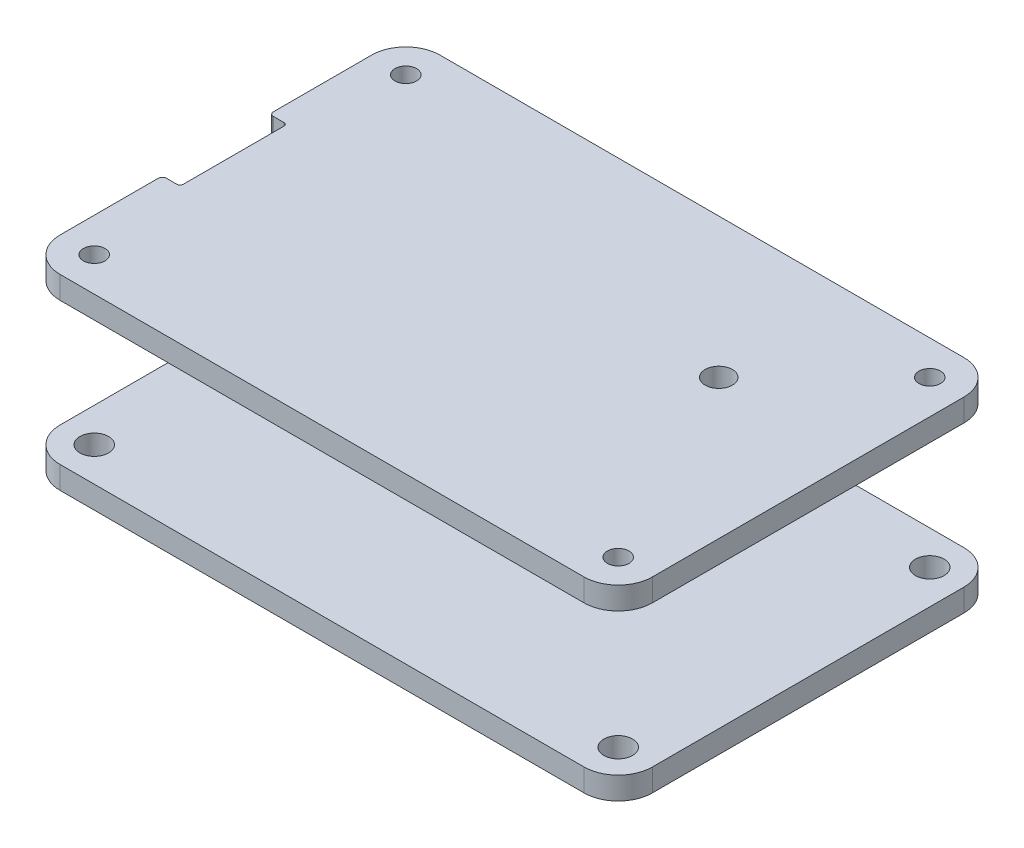
ISO-10303-21;
HEADER;
FILE_DESCRIPTION(('STEP AP214'),'2;1');
FILE_NAME('part.step','',(''),(''),'','','');
FILE_SCHEMA(('AUTOMOTIVE_DESIGN { 1 0 10303 214 1 1 1 1 }'));
ENDSEC;
DATA;
#1=APPLICATION_CONTEXT('core data for automotive mechanical design processes');
#2=APPLICATION_PROTOCOL_DEFINITION('international standard','automotive_design',2000,#1);
#3=PRODUCT_CONTEXT('',#1,'mechanical');
#4=PRODUCT('Part','Part','',(#3));
#5=PRODUCT_RELATED_PRODUCT_CATEGORY('part','',(#4));
#6=PRODUCT_DEFINITION_FORMATION('','',#4);
#7=PRODUCT_DEFINITION_CONTEXT('part definition',#1,'design');
#8=PRODUCT_DEFINITION('design','',#6,#7);
#9=PRODUCT_DEFINITION_SHAPE('','',#8);
#10=(LENGTH_UNIT() NAMED_UNIT(*) SI_UNIT(.MILLI.,.METRE.));
#11=(NAMED_UNIT(*) PLANE_ANGLE_UNIT() SI_UNIT($,.RADIAN.));
#12=(NAMED_UNIT(*) SI_UNIT($,.STERADIAN.) SOLID_ANGLE_UNIT());
#13=UNCERTAINTY_MEASURE_WITH_UNIT(LENGTH_MEASURE(1.E-05),#10,'distance_accuracy_value','');
#14=(GEOMETRIC_REPRESENTATION_CONTEXT(3) GLOBAL_UNCERTAINTY_ASSIGNED_CONTEXT((#13)) GLOBAL_UNIT_ASSIGNED_CONTEXT((#10,
#11,#12)) REPRESENTATION_CONTEXT('',''));
#15=CARTESIAN_POINT('',(0.,0.,0.));
#16=DIRECTION('',(0.,0.,1.));
#17=DIRECTION('',(1.,0.,0.));
#18=AXIS2_PLACEMENT_3D('',#15,#16,#17);
#19=CARTESIAN_POINT('',(77.,0.,-3.));
#20=DIRECTION('',(0.,1.,0.));
#21=DIRECTION('',(0.,0.,1.));
#22=AXIS2_PLACEMENT_3D('',#19,#20,#21);
#23=PLANE('',#22);
#24=CARTESIAN_POINT('',(3.,0.,-3.));
#25=DIRECTION('',(0.,1.,0.));
#26=DIRECTION('',(0.,0.,1.));
#27=AXIS2_PLACEMENT_3D('',#24,#25,#26);
#28=CIRCLE('',#27,2.0238);
#29=CARTESIAN_POINT('',(3.,0.,-0.9762));
#30=VERTEX_POINT('',#29);
#31=EDGE_CURVE('E151',#30,#30,#28,.F.);
#32=ORIENTED_EDGE('',*,*,#31,.T.);
#33=EDGE_LOOP('',(#32));
#34=FACE_BOUND('',#33,.T.);
#35=CARTESIAN_POINT('',(77.,0.,-47.));
#36=DIRECTION('',(0.,1.,0.));
#37=DIRECTION('',(0.,0.,1.));
#38=AXIS2_PLACEMENT_3D('',#35,#36,#37);
#39=CIRCLE('',#38,2.02380000000001);
#40=CARTESIAN_POINT('',(77.,0.,-44.9762));
#41=VERTEX_POINT('',#40);
#42=EDGE_CURVE('E150',#41,#41,#39,.F.);
#43=ORIENTED_EDGE('',*,*,#42,.T.);
#44=EDGE_LOOP('',(#43));
#45=FACE_BOUND('',#44,.T.);
#46=CARTESIAN_POINT('',(3.,0.,-47.));
#47=DIRECTION('',(0.,1.,0.));
#48=DIRECTION('',(0.,0.,1.));
#49=AXIS2_PLACEMENT_3D('',#46,#47,#48);
#50=CIRCLE('',#49,2.0238);
#51=CARTESIAN_POINT('',(3.,0.,-44.9762));
#52=VERTEX_POINT('',#51);
#53=EDGE_CURVE('E143',#52,#52,#50,.F.);
#54=ORIENTED_EDGE('',*,*,#53,.T.);
#55=EDGE_LOOP('',(#54));
#56=FACE_BOUND('',#55,.T.);
#57=CARTESIAN_POINT('',(77.,0.,-3.));
#58=DIRECTION('',(0.,1.,0.));
#59=DIRECTION('',(0.,0.,1.));
#60=AXIS2_PLACEMENT_3D('',#57,#58,#59);
#61=CIRCLE('',#60,2.0238);
#62=CARTESIAN_POINT('',(77.,0.,-0.976199999999996));
#63=VERTEX_POINT('',#62);
#64=EDGE_CURVE('E158',#63,#63,#61,.F.);
#65=ORIENTED_EDGE('',*,*,#64,.T.);
#66=EDGE_LOOP('',(#65));
#67=FACE_BOUND('',#66,.T.);
#68=CARTESIAN_POINT('',(77.,0.,-3.));
#69=DIRECTION('',(0.,1.,0.));
#70=DIRECTION('',(0.,0.,1.));
#71=AXIS2_PLACEMENT_3D('',#68,#69,#70);
#72=CIRCLE('',#71,4.8262);
#73=CARTESIAN_POINT('',(77.,0.,1.8262));
#74=VERTEX_POINT('',#73);
#75=CARTESIAN_POINT('',(81.8262,0.,-3.));
#76=VERTEX_POINT('',#75);
#77=EDGE_CURVE('E138',#74,#76,#72,.T.);
#78=ORIENTED_EDGE('',*,*,#77,.T.);
#79=DIRECTION('',(0.,0.,-1.));
#80=VECTOR('',#79,1.);
#81=CARTESIAN_POINT('',(81.8262,0.,-3.));
#82=LINE('',#81,#80);
#83=CARTESIAN_POINT('',(81.8262,0.,-47.));
#84=VERTEX_POINT('',#83);
#85=EDGE_CURVE('E88',#76,#84,#82,.T.);
#86=ORIENTED_EDGE('',*,*,#85,.T.);
#87=CARTESIAN_POINT('',(77.,0.,-47.));
#88=DIRECTION('',(0.,1.,0.));
#89=DIRECTION('',(0.,0.,1.));
#90=AXIS2_PLACEMENT_3D('',#87,#88,#89);
#91=CIRCLE('',#90,4.8262);
#92=CARTESIAN_POINT('',(77.,0.,-51.8262));
#93=VERTEX_POINT('',#92);
#94=EDGE_CURVE('E93',#84,#93,#91,.T.);
#95=ORIENTED_EDGE('',*,*,#94,.T.);
#96=DIRECTION('',(-1.,0.,0.));
#97=VECTOR('',#96,1.);
#98=CARTESIAN_POINT('',(77.,0.,-51.8262));
#99=LINE('',#98,#97);
#100=CARTESIAN_POINT('',(3.00000000000002,0.,-51.8262));
#101=VERTEX_POINT('',#100);
#102=EDGE_CURVE('E99',#93,#101,#99,.T.);
#103=ORIENTED_EDGE('',*,*,#102,.T.);
#104=CARTESIAN_POINT('',(3.,0.,-47.));
#105=DIRECTION('',(0.,1.,0.));
#106=DIRECTION('',(0.,0.,1.));
#107=AXIS2_PLACEMENT_3D('',#104,#105,#106);
#108=CIRCLE('',#107,4.8262);
#109=CARTESIAN_POINT('',(-1.8262,0.,-47.));
#110=VERTEX_POINT('',#109);
#111=EDGE_CURVE('E113',#101,#110,#108,.T.);
#112=ORIENTED_EDGE('',*,*,#111,.T.);
#113=DIRECTION('',(0.,0.,1.));
#114=VECTOR('',#113,1.);
#115=CARTESIAN_POINT('',(-1.8262,0.,-47.));
#116=LINE('',#115,#114);
#117=CARTESIAN_POINT('',(-1.8262,0.,-3.00000000000002));
#118=VERTEX_POINT('',#117);
#119=EDGE_CURVE('E107',#110,#118,#116,.T.);
#120=ORIENTED_EDGE('',*,*,#119,.T.);
#121=CARTESIAN_POINT('',(3.,0.,-3.));
#122=DIRECTION('',(0.,1.,0.));
#123=DIRECTION('',(0.,0.,1.));
#124=AXIS2_PLACEMENT_3D('',#121,#122,#123);
#125=CIRCLE('',#124,4.8262);
#126=CARTESIAN_POINT('',(3.,0.,1.8262));
#127=VERTEX_POINT('',#126);
#128=EDGE_CURVE('E110',#118,#127,#125,.T.);
#129=ORIENTED_EDGE('',*,*,#128,.T.);
#130=DIRECTION('',(1.,0.,0.));
#131=VECTOR('',#130,1.);
#132=CARTESIAN_POINT('',(3.,0.,1.8262));
#133=LINE('',#132,#131);
#134=EDGE_CURVE('E76',#127,#74,#133,.T.);
#135=ORIENTED_EDGE('',*,*,#134,.T.);
#136=EDGE_LOOP('',(#78,#86,#95,#103,#112,#120,#129,#135));
#137=FACE_BOUND('',#136,.T.);
#138=ADVANCED_FACE('F57',(#34,#45,#56,#67,#137),#23,.T.);
#139=CARTESIAN_POINT('',(77.,-3.175,-3.));
#140=DIRECTION('',(0.,1.,0.));
#141=DIRECTION('',(0.,0.,1.));
#142=AXIS2_PLACEMENT_3D('',#139,#140,#141);
#143=PLANE('',#142);
#144=CARTESIAN_POINT('',(3.,-3.175,-3.));
#145=DIRECTION('',(0.,1.,0.));
#146=DIRECTION('',(0.,0.,1.));
#147=AXIS2_PLACEMENT_3D('',#144,#145,#146);
#148=CIRCLE('',#147,2.0238);
#149=CARTESIAN_POINT('',(3.,-3.175,-0.9762));
#150=VERTEX_POINT('',#149);
#151=EDGE_CURVE('E154',#150,#150,#148,.F.);
#152=ORIENTED_EDGE('',*,*,#151,.F.);
#153=EDGE_LOOP('',(#152));
#154=FACE_BOUND('',#153,.T.);
#155=CARTESIAN_POINT('',(77.,-3.175,-47.));
#156=DIRECTION('',(0.,1.,0.));
#157=DIRECTION('',(0.,0.,1.));
#158=AXIS2_PLACEMENT_3D('',#155,#156,#157);
#159=CIRCLE('',#158,2.02380000000001);
#160=CARTESIAN_POINT('',(77.,-3.175,-44.9762));
#161=VERTEX_POINT('',#160);
#162=EDGE_CURVE('E155',#161,#161,#159,.F.);
#163=ORIENTED_EDGE('',*,*,#162,.F.);
#164=EDGE_LOOP('',(#163));
#165=FACE_BOUND('',#164,.T.);
#166=CARTESIAN_POINT('',(3.,-3.175,-47.));
#167=DIRECTION('',(0.,1.,0.));
#168=DIRECTION('',(0.,0.,1.));
#169=AXIS2_PLACEMENT_3D('',#166,#167,#168);
#170=CIRCLE('',#169,2.0238);
#171=CARTESIAN_POINT('',(3.,-3.175,-44.9762));
#172=VERTEX_POINT('',#171);
#173=EDGE_CURVE('E146',#172,#172,#170,.F.);
#174=ORIENTED_EDGE('',*,*,#173,.F.);
#175=EDGE_LOOP('',(#174));
#176=FACE_BOUND('',#175,.T.);
#177=CARTESIAN_POINT('',(77.,-3.175,-3.));
#178=DIRECTION('',(0.,1.,0.));
#179=DIRECTION('',(0.,0.,1.));
#180=AXIS2_PLACEMENT_3D('',#177,#178,#179);
#181=CIRCLE('',#180,2.0238);
#182=CARTESIAN_POINT('',(77.,-3.175,-0.976199999999996));
#183=VERTEX_POINT('',#182);
#184=EDGE_CURVE('E61',#183,#183,#181,.F.);
#185=ORIENTED_EDGE('',*,*,#184,.F.);
#186=EDGE_LOOP('',(#185));
#187=FACE_BOUND('',#186,.T.);
#188=CARTESIAN_POINT('',(77.,-3.175,-3.));
#189=DIRECTION('',(0.,1.,0.));
#190=DIRECTION('',(0.,0.,1.));
#191=AXIS2_PLACEMENT_3D('',#188,#189,#190);
#192=CIRCLE('',#191,4.8262);
#193=CARTESIAN_POINT('',(77.,-3.175,1.8262));
#194=VERTEX_POINT('',#193);
#195=CARTESIAN_POINT('',(81.8262,-3.175,-3.));
#196=VERTEX_POINT('',#195);
#197=EDGE_CURVE('E164',#194,#196,#192,.T.);
#198=ORIENTED_EDGE('',*,*,#197,.F.);
#199=DIRECTION('',(1.,0.,0.));
#200=VECTOR('',#199,1.);
#201=CARTESIAN_POINT('',(3.,-3.175,1.8262));
#202=LINE('',#201,#200);
#203=CARTESIAN_POINT('',(3.,-3.175,1.8262));
#204=VERTEX_POINT('',#203);
#205=EDGE_CURVE('E140',#204,#194,#202,.T.);
#206=ORIENTED_EDGE('',*,*,#205,.F.);
#207=CARTESIAN_POINT('',(3.,-3.175,-3.));
#208=DIRECTION('',(0.,1.,0.));
#209=DIRECTION('',(0.,0.,1.));
#210=AXIS2_PLACEMENT_3D('',#207,#208,#209);
#211=CIRCLE('',#210,4.8262);
#212=CARTESIAN_POINT('',(-1.8262,-3.175,-3.00000000000002));
#213=VERTEX_POINT('',#212);
#214=EDGE_CURVE('E192',#213,#204,#211,.T.);
#215=ORIENTED_EDGE('',*,*,#214,.F.);
#216=DIRECTION('',(0.,0.,1.));
#217=VECTOR('',#216,1.);
#218=CARTESIAN_POINT('',(-1.8262,-3.175,-47.));
#219=LINE('',#218,#217);
#220=CARTESIAN_POINT('',(-1.8262,-3.175,-47.));
#221=VERTEX_POINT('',#220);
#222=EDGE_CURVE('E124',#221,#213,#219,.T.);
#223=ORIENTED_EDGE('',*,*,#222,.F.);
#224=CARTESIAN_POINT('',(3.,-3.175,-47.));
#225=DIRECTION('',(0.,1.,0.));
#226=DIRECTION('',(0.,0.,1.));
#227=AXIS2_PLACEMENT_3D('',#224,#225,#226);
#228=CIRCLE('',#227,4.8262);
#229=CARTESIAN_POINT('',(3.00000000000002,-3.175,-51.8262));
#230=VERTEX_POINT('',#229);
#231=EDGE_CURVE('E198',#230,#221,#228,.T.);
#232=ORIENTED_EDGE('',*,*,#231,.F.);
#233=DIRECTION('',(-1.,0.,0.));
#234=VECTOR('',#233,1.);
#235=CARTESIAN_POINT('',(77.,-3.175,-51.8262));
#236=LINE('',#235,#234);
#237=CARTESIAN_POINT('',(77.,-3.175,-51.8262));
#238=VERTEX_POINT('',#237);
#239=EDGE_CURVE('E203',#238,#230,#236,.T.);
#240=ORIENTED_EDGE('',*,*,#239,.F.);
#241=CARTESIAN_POINT('',(77.,-3.175,-47.));
#242=DIRECTION('',(0.,1.,0.));
#243=DIRECTION('',(0.,0.,1.));
#244=AXIS2_PLACEMENT_3D('',#241,#242,#243);
#245=CIRCLE('',#244,4.8262);
#246=CARTESIAN_POINT('',(81.8262,-3.175,-47.));
#247=VERTEX_POINT('',#246);
#248=EDGE_CURVE('E179',#247,#238,#245,.T.);
#249=ORIENTED_EDGE('',*,*,#248,.F.);
#250=DIRECTION('',(0.,0.,-1.));
#251=VECTOR('',#250,1.);
#252=CARTESIAN_POINT('',(81.8262,-3.175,-3.));
#253=LINE('',#252,#251);
#254=EDGE_CURVE('E169',#196,#247,#253,.T.);
#255=ORIENTED_EDGE('',*,*,#254,.F.);
#256=EDGE_LOOP('',(#198,#206,#215,#223,#232,#240,#249,#255));
#257=FACE_BOUND('',#256,.T.);
#258=ADVANCED_FACE('F231',(#154,#165,#176,#187,#257),#143,.F.);
#259=CARTESIAN_POINT('',(77.,0.,-3.));
#260=DIRECTION('',(0.,-1.,0.));
#261=DIRECTION('',(0.,0.,-1.));
#262=AXIS2_PLACEMENT_3D('',#259,#260,#261);
#263=CYLINDRICAL_SURFACE('',#262,4.8262);
#264=ORIENTED_EDGE('',*,*,#197,.T.);
#265=DIRECTION('',(0.,1.,0.));
#266=VECTOR('',#265,1.);
#267=CARTESIAN_POINT('',(81.8262,0.,-3.));
#268=LINE('',#267,#266);
#269=EDGE_CURVE('E14',#76,#196,#268,.F.);
#270=ORIENTED_EDGE('',*,*,#269,.F.);
#271=ORIENTED_EDGE('',*,*,#77,.F.);
#272=DIRECTION('',(0.,-1.,0.));
#273=VECTOR('',#272,1.);
#274=CARTESIAN_POINT('',(77.,0.,1.8262));
#275=LINE('',#274,#273);
#276=EDGE_CURVE('E134',#74,#194,#275,.T.);
#277=ORIENTED_EDGE('',*,*,#276,.T.);
#278=EDGE_LOOP('',(#264,#270,#271,#277));
#279=FACE_BOUND('',#278,.T.);
#280=ADVANCED_FACE('F253',(#279),#263,.T.);
#281=CARTESIAN_POINT('',(81.8262,0.,-3.));
#282=DIRECTION('',(-1.,0.,0.));
#283=DIRECTION('',(0.,0.,1.));
#284=AXIS2_PLACEMENT_3D('',#281,#282,#283);
#285=PLANE('',#284);
#286=ORIENTED_EDGE('',*,*,#254,.T.);
#287=DIRECTION('',(0.,-1.,0.));
#288=VECTOR('',#287,1.);
#289=CARTESIAN_POINT('',(81.8262,0.,-47.));
#290=LINE('',#289,#288);
#291=EDGE_CURVE('E67',#84,#247,#290,.T.);
#292=ORIENTED_EDGE('',*,*,#291,.F.);
#293=ORIENTED_EDGE('',*,*,#85,.F.);
#294=ORIENTED_EDGE('',*,*,#269,.T.);
#295=EDGE_LOOP('',(#286,#292,#293,#294));
#296=FACE_BOUND('',#295,.T.);
#297=ADVANCED_FACE('F251',(#296),#285,.F.);
#298=CARTESIAN_POINT('',(77.,0.,-47.));
#299=DIRECTION('',(0.,-1.,0.));
#300=DIRECTION('',(0.,0.,-1.));
#301=AXIS2_PLACEMENT_3D('',#298,#299,#300);
#302=CYLINDRICAL_SURFACE('',#301,4.8262);
#303=ORIENTED_EDGE('',*,*,#248,.T.);
#304=DIRECTION('',(0.,1.,0.));
#305=VECTOR('',#304,1.);
#306=CARTESIAN_POINT('',(77.,0.,-51.8262));
#307=LINE('',#306,#305);
#308=EDGE_CURVE('E219',#93,#238,#307,.F.);
#309=ORIENTED_EDGE('',*,*,#308,.F.);
#310=ORIENTED_EDGE('',*,*,#94,.F.);
#311=ORIENTED_EDGE('',*,*,#291,.T.);
#312=EDGE_LOOP('',(#303,#309,#310,#311));
#313=FACE_BOUND('',#312,.T.);
#314=ADVANCED_FACE('F218',(#313),#302,.T.);
#315=CARTESIAN_POINT('',(77.,0.,-51.8262));
#316=DIRECTION('',(0.,0.,1.));
#317=DIRECTION('',(1.,0.,0.));
#318=AXIS2_PLACEMENT_3D('',#315,#316,#317);
#319=PLANE('',#318);
#320=ORIENTED_EDGE('',*,*,#239,.T.);
#321=DIRECTION('',(0.,-1.,0.));
#322=VECTOR('',#321,1.);
#323=CARTESIAN_POINT('',(3.00000000000002,0.,-51.8262));
#324=LINE('',#323,#322);
#325=EDGE_CURVE('E228',#101,#230,#324,.T.);
#326=ORIENTED_EDGE('',*,*,#325,.F.);
#327=ORIENTED_EDGE('',*,*,#102,.F.);
#328=ORIENTED_EDGE('',*,*,#308,.T.);
#329=EDGE_LOOP('',(#320,#326,#327,#328));
#330=FACE_BOUND('',#329,.T.);
#331=ADVANCED_FACE('F226',(#330),#319,.F.);
#332=CARTESIAN_POINT('',(3.,0.,-47.));
#333=DIRECTION('',(0.,-1.,0.));
#334=DIRECTION('',(0.,0.,-1.));
#335=AXIS2_PLACEMENT_3D('',#332,#333,#334);
#336=CYLINDRICAL_SURFACE('',#335,4.8262);
#337=ORIENTED_EDGE('',*,*,#231,.T.);
#338=DIRECTION('',(0.,1.,0.));
#339=VECTOR('',#338,1.);
#340=CARTESIAN_POINT('',(-1.8262,0.,-47.));
#341=LINE('',#340,#339);
#342=EDGE_CURVE('E128',#110,#221,#341,.F.);
#343=ORIENTED_EDGE('',*,*,#342,.F.);
#344=ORIENTED_EDGE('',*,*,#111,.F.);
#345=ORIENTED_EDGE('',*,*,#325,.T.);
#346=EDGE_LOOP('',(#337,#343,#344,#345));
#347=FACE_BOUND('',#346,.T.);
#348=ADVANCED_FACE('F59',(#347),#336,.T.);
#349=CARTESIAN_POINT('',(-1.8262,0.,-47.));
#350=DIRECTION('',(1.,0.,0.));
#351=DIRECTION('',(0.,0.,-1.));
#352=AXIS2_PLACEMENT_3D('',#349,#350,#351);
#353=PLANE('',#352);
#354=ORIENTED_EDGE('',*,*,#222,.T.);
#355=DIRECTION('',(0.,-1.,0.));
#356=VECTOR('',#355,1.);
#357=CARTESIAN_POINT('',(-1.8262,0.,-3.00000000000002));
#358=LINE('',#357,#356);
#359=EDGE_CURVE('E120',#118,#213,#358,.T.);
#360=ORIENTED_EDGE('',*,*,#359,.F.);
#361=ORIENTED_EDGE('',*,*,#119,.F.);
#362=ORIENTED_EDGE('',*,*,#342,.T.);
#363=EDGE_LOOP('',(#354,#360,#361,#362));
#364=FACE_BOUND('',#363,.T.);
#365=ADVANCED_FACE('F121',(#364),#353,.F.);
#366=CARTESIAN_POINT('',(3.,0.,-3.));
#367=DIRECTION('',(0.,-1.,0.));
#368=DIRECTION('',(0.,0.,-1.));
#369=AXIS2_PLACEMENT_3D('',#366,#367,#368);
#370=CYLINDRICAL_SURFACE('',#369,4.8262);
#371=ORIENTED_EDGE('',*,*,#214,.T.);
#372=DIRECTION('',(0.,1.,0.));
#373=VECTOR('',#372,1.);
#374=CARTESIAN_POINT('',(3.,0.,1.8262));
#375=LINE('',#374,#373);
#376=EDGE_CURVE('E129',#127,#204,#375,.F.);
#377=ORIENTED_EDGE('',*,*,#376,.F.);
#378=ORIENTED_EDGE('',*,*,#128,.F.);
#379=ORIENTED_EDGE('',*,*,#359,.T.);
#380=EDGE_LOOP('',(#371,#377,#378,#379));
#381=FACE_BOUND('',#380,.T.);
#382=ADVANCED_FACE('F131',(#381),#370,.T.);
#383=CARTESIAN_POINT('',(3.,0.,1.8262));
#384=DIRECTION('',(0.,0.,-1.));
#385=DIRECTION('',(-1.,0.,0.));
#386=AXIS2_PLACEMENT_3D('',#383,#384,#385);
#387=PLANE('',#386);
#388=ORIENTED_EDGE('',*,*,#205,.T.);
#389=ORIENTED_EDGE('',*,*,#276,.F.);
#390=ORIENTED_EDGE('',*,*,#134,.F.);
#391=ORIENTED_EDGE('',*,*,#376,.T.);
#392=EDGE_LOOP('',(#388,#389,#390,#391));
#393=FACE_BOUND('',#392,.T.);
#394=ADVANCED_FACE('F244',(#393),#387,.F.);
#395=CARTESIAN_POINT('',(77.,23.246,-3.));
#396=DIRECTION('',(0.,-1.,0.));
#397=DIRECTION('',(0.,0.,-1.));
#398=AXIS2_PLACEMENT_3D('',#395,#396,#397);
#399=CYLINDRICAL_SURFACE('',#398,2.0238);
#400=ORIENTED_EDGE('',*,*,#64,.F.);
#401=EDGE_LOOP('',(#400));
#402=FACE_BOUND('',#401,.T.);
#403=ORIENTED_EDGE('',*,*,#184,.T.);
#404=EDGE_LOOP('',(#403));
#405=FACE_BOUND('',#404,.T.);
#406=ADVANCED_FACE('F277',(#402,#405),#399,.F.);
#407=CARTESIAN_POINT('',(3.,23.246,-47.));
#408=DIRECTION('',(0.,-1.,0.));
#409=DIRECTION('',(0.,0.,-1.));
#410=AXIS2_PLACEMENT_3D('',#407,#408,#409);
#411=CYLINDRICAL_SURFACE('',#410,2.0238);
#412=ORIENTED_EDGE('',*,*,#53,.F.);
#413=EDGE_LOOP('',(#412));
#414=FACE_BOUND('',#413,.T.);
#415=ORIENTED_EDGE('',*,*,#173,.T.);
#416=EDGE_LOOP('',(#415));
#417=FACE_BOUND('',#416,.T.);
#418=ADVANCED_FACE('F275',(#414,#417),#411,.F.);
#419=CARTESIAN_POINT('',(77.,23.246,-47.));
#420=DIRECTION('',(0.,-1.,0.));
#421=DIRECTION('',(0.,0.,-1.));
#422=AXIS2_PLACEMENT_3D('',#419,#420,#421);
#423=CYLINDRICAL_SURFACE('',#422,2.02380000000001);
#424=ORIENTED_EDGE('',*,*,#42,.F.);
#425=EDGE_LOOP('',(#424));
#426=FACE_BOUND('',#425,.T.);
#427=ORIENTED_EDGE('',*,*,#162,.T.);
#428=EDGE_LOOP('',(#427));
#429=FACE_BOUND('',#428,.T.);
#430=ADVANCED_FACE('F271',(#426,#429),#423,.F.);
#431=CARTESIAN_POINT('',(3.,23.246,-3.));
#432=DIRECTION('',(0.,-1.,0.));
#433=DIRECTION('',(0.,0.,-1.));
#434=AXIS2_PLACEMENT_3D('',#431,#432,#433);
#435=CYLINDRICAL_SURFACE('',#434,2.0238);
#436=ORIENTED_EDGE('',*,*,#31,.F.);
#437=EDGE_LOOP('',(#436));
#438=FACE_BOUND('',#437,.T.);
#439=ORIENTED_EDGE('',*,*,#151,.T.);
#440=EDGE_LOOP('',(#439));
#441=FACE_BOUND('',#440,.T.);
#442=ADVANCED_FACE('F274',(#438,#441),#435,.F.);
#443=CLOSED_SHELL('',(#138,#258,#280,#297,#314,#331,#348,#365,#382,#394,#406,#418,#430,#442));
#444=MANIFOLD_SOLID_BREP('B2',#443);
#445=CARTESIAN_POINT('',(-1.8262,23.245,-47.));
#446=DIRECTION('',(1.,0.,0.));
#447=DIRECTION('',(0.,0.,-1.));
#448=AXIS2_PLACEMENT_3D('',#445,#446,#447);
#449=PLANE('',#448);
#450=DIRECTION('',(0.,0.,1.));
#451=VECTOR('',#450,1.);
#452=CARTESIAN_POINT('',(-1.8262,20.07,-47.));
#453=LINE('',#452,#451);
#454=CARTESIAN_POINT('',(-1.8262,20.07,-47.));
#455=VERTEX_POINT('',#454);
#456=CARTESIAN_POINT('',(-1.8262,20.07,-33.1311));
#457=VERTEX_POINT('',#456);
#458=EDGE_CURVE('E577',#455,#457,#453,.T.);
#459=ORIENTED_EDGE('',*,*,#458,.T.);
#460=DIRECTION('',(0.,1.,0.));
#461=VECTOR('',#460,1.);
#462=CARTESIAN_POINT('',(-1.8262,23.245,-33.1311));
#463=LINE('',#462,#461);
#464=CARTESIAN_POINT('',(-1.8262,23.245,-33.1311));
#465=VERTEX_POINT('',#464);
#466=EDGE_CURVE('E545',#457,#465,#463,.T.);
#467=ORIENTED_EDGE('',*,*,#466,.T.);
#468=DIRECTION('',(0.,0.,1.));
#469=VECTOR('',#468,1.);
#470=CARTESIAN_POINT('',(-1.8262,23.245,-47.));
#471=LINE('',#470,#469);
#472=CARTESIAN_POINT('',(-1.8262,23.245,-47.));
#473=VERTEX_POINT('',#472);
#474=EDGE_CURVE('E602',#473,#465,#471,.T.);
#475=ORIENTED_EDGE('',*,*,#474,.F.);
#476=DIRECTION('',(0.,1.,0.));
#477=VECTOR('',#476,1.);
#478=CARTESIAN_POINT('',(-1.8262,23.245,-47.));
#479=LINE('',#478,#477);
#480=EDGE_CURVE('E555',#473,#455,#479,.F.);
#481=ORIENTED_EDGE('',*,*,#480,.T.);
#482=EDGE_LOOP('',(#459,#467,#475,#481));
#483=FACE_BOUND('',#482,.T.);
#484=ADVANCED_FACE('F394',(#483),#449,.F.);
#485=CARTESIAN_POINT('',(77.,23.245,-3.));
#486=DIRECTION('',(0.,1.,0.));
#487=DIRECTION('',(0.,0.,1.));
#488=AXIS2_PLACEMENT_3D('',#485,#486,#487);
#489=PLANE('',#488);
#490=DIRECTION('',(1.,0.,0.));
#491=VECTOR('',#490,1.);
#492=CARTESIAN_POINT('',(77.,23.245,-17.4451));
#493=LINE('',#492,#491);
#494=CARTESIAN_POINT('',(-1.25,23.245,-17.4451));
#495=VERTEX_POINT('',#494);
#496=CARTESIAN_POINT('',(0.25,23.245,-17.4451));
#497=VERTEX_POINT('',#496);
#498=EDGE_CURVE('E589',#495,#497,#493,.T.);
#499=ORIENTED_EDGE('',*,*,#498,.F.);
#500=CARTESIAN_POINT('',(-1.25,23.245,-16.8689));
#501=DIRECTION('',(0.,1.,0.));
#502=DIRECTION('',(0.,0.,1.));
#503=AXIS2_PLACEMENT_3D('',#500,#501,#502);
#504=CIRCLE('',#503,0.5762);
#505=CARTESIAN_POINT('',(-1.8262,23.245,-16.8689));
#506=VERTEX_POINT('',#505);
#507=EDGE_CURVE('E608',#495,#506,#504,.T.);
#508=ORIENTED_EDGE('',*,*,#507,.T.);
#509=DIRECTION('',(0.,0.,1.));
#510=VECTOR('',#509,1.);
#511=CARTESIAN_POINT('',(-1.8262,23.245,-47.));
#512=LINE('',#511,#510);
#513=CARTESIAN_POINT('',(-1.8262,23.245,-3.00000000000002));
#514=VERTEX_POINT('',#513);
#515=EDGE_CURVE('E601',#506,#514,#512,.T.);
#516=ORIENTED_EDGE('',*,*,#515,.T.);
#517=CARTESIAN_POINT('',(3.,23.245,-3.));
#518=DIRECTION('',(0.,1.,0.));
#519=DIRECTION('',(0.,0.,1.));
#520=AXIS2_PLACEMENT_3D('',#517,#518,#519);
#521=CIRCLE('',#520,4.8262);
#522=CARTESIAN_POINT('',(3.,23.245,1.8262));
#523=VERTEX_POINT('',#522);
#524=EDGE_CURVE('E605',#514,#523,#521,.T.);
#525=ORIENTED_EDGE('',*,*,#524,.T.);
#526=DIRECTION('',(1.,0.,0.));
#527=VECTOR('',#526,1.);
#528=CARTESIAN_POINT('',(3.,23.245,1.8262));
#529=LINE('',#528,#527);
#530=CARTESIAN_POINT('',(77.,23.245,1.8262));
#531=VERTEX_POINT('',#530);
#532=EDGE_CURVE('E619',#523,#531,#529,.T.);
#533=ORIENTED_EDGE('',*,*,#532,.T.);
#534=CARTESIAN_POINT('',(77.,23.245,-3.));
#535=DIRECTION('',(0.,1.,0.));
#536=DIRECTION('',(0.,0.,1.));
#537=AXIS2_PLACEMENT_3D('',#534,#535,#536);
#538=CIRCLE('',#537,4.8262);
#539=CARTESIAN_POINT('',(81.8262,23.245,-3.));
#540=VERTEX_POINT('',#539);
#541=EDGE_CURVE('E574',#531,#540,#538,.T.);
#542=ORIENTED_EDGE('',*,*,#541,.T.);
#543=DIRECTION('',(0.,0.,-1.));
#544=VECTOR('',#543,1.);
#545=CARTESIAN_POINT('',(81.8262,23.245,-3.));
#546=LINE('',#545,#544);
#547=CARTESIAN_POINT('',(81.8262,23.245,-47.));
#548=VERTEX_POINT('',#547);
#549=EDGE_CURVE('E483',#540,#548,#546,.T.);
#550=ORIENTED_EDGE('',*,*,#549,.T.);
#551=CARTESIAN_POINT('',(77.,23.245,-47.));
#552=DIRECTION('',(0.,1.,0.));
#553=DIRECTION('',(0.,0.,1.));
#554=AXIS2_PLACEMENT_3D('',#551,#552,#553);
#555=CIRCLE('',#554,4.8262);
#556=CARTESIAN_POINT('',(77.,23.245,-51.8262));
#557=VERTEX_POINT('',#556);
#558=EDGE_CURVE('E595',#548,#557,#555,.T.);
#559=ORIENTED_EDGE('',*,*,#558,.T.);
#560=DIRECTION('',(-1.,0.,0.));
#561=VECTOR('',#560,1.);
#562=CARTESIAN_POINT('',(77.,23.245,-51.8262));
#563=LINE('',#562,#561);
#564=CARTESIAN_POINT('',(3.00000000000002,23.245,-51.8262));
#565=VERTEX_POINT('',#564);
#566=EDGE_CURVE('E597',#557,#565,#563,.T.);
#567=ORIENTED_EDGE('',*,*,#566,.T.);
#568=CARTESIAN_POINT('',(3.,23.245,-47.));
#569=DIRECTION('',(0.,1.,0.));
#570=DIRECTION('',(0.,0.,1.));
#571=AXIS2_PLACEMENT_3D('',#568,#569,#570);
#572=CIRCLE('',#571,4.8262);
#573=EDGE_CURVE('E599',#565,#473,#572,.T.);
#574=ORIENTED_EDGE('',*,*,#573,.T.);
#575=ORIENTED_EDGE('',*,*,#474,.T.);
#576=CARTESIAN_POINT('',(-1.25,23.245,-33.1311));
#577=DIRECTION('',(0.,1.,0.));
#578=DIRECTION('',(0.,0.,1.));
#579=AXIS2_PLACEMENT_3D('',#576,#577,#578);
#580=CIRCLE('',#579,0.5762);
#581=CARTESIAN_POINT('',(-1.25,23.245,-32.5549));
#582=VERTEX_POINT('',#581);
#583=EDGE_CURVE('E606',#465,#582,#580,.T.);
#584=ORIENTED_EDGE('',*,*,#583,.T.);
#585=DIRECTION('',(-1.,0.,0.));
#586=VECTOR('',#585,1.);
#587=CARTESIAN_POINT('',(77.,23.245,-32.5549));
#588=LINE('',#587,#586);
#589=CARTESIAN_POINT('',(0.249999999999997,23.245,-32.5549));
#590=VERTEX_POINT('',#589);
#591=EDGE_CURVE('E586',#590,#582,#588,.T.);
#592=ORIENTED_EDGE('',*,*,#591,.F.);
#593=CARTESIAN_POINT('',(0.249999999999997,23.245,-32.1311));
#594=DIRECTION('',(0.,1.,0.));
#595=DIRECTION('',(0.,0.,1.));
#596=AXIS2_PLACEMENT_3D('',#593,#594,#595);
#597=CIRCLE('',#596,0.4238);
#598=CARTESIAN_POINT('',(0.673799999999998,23.245,-32.1311));
#599=VERTEX_POINT('',#598);
#600=EDGE_CURVE('E404',#590,#599,#597,.F.);
#601=ORIENTED_EDGE('',*,*,#600,.T.);
#602=DIRECTION('',(0.,0.,-1.));
#603=VECTOR('',#602,1.);
#604=CARTESIAN_POINT('',(0.673800000000002,23.245,-2.99999999999999));
#605=LINE('',#604,#603);
#606=CARTESIAN_POINT('',(0.673799999999999,23.245,-17.8689));
#607=VERTEX_POINT('',#606);
#608=EDGE_CURVE('E522',#607,#599,#605,.T.);
#609=ORIENTED_EDGE('',*,*,#608,.F.);
#610=CARTESIAN_POINT('',(0.249999999999999,23.245,-17.8689));
#611=DIRECTION('',(0.,1.,0.));
#612=DIRECTION('',(0.,0.,1.));
#613=AXIS2_PLACEMENT_3D('',#610,#611,#612);
#614=CIRCLE('',#613,0.4238);
#615=EDGE_CURVE('E548',#607,#497,#614,.F.);
#616=ORIENTED_EDGE('',*,*,#615,.T.);
#617=EDGE_LOOP('',(#499,#508,#516,#525,#533,#542,#550,#559,#567,#574,#575,#584,#592,#601,#609,#616));
#618=FACE_BOUND('',#617,.T.);
#619=CARTESIAN_POINT('',(62.1,23.245,-32.1));
#620=DIRECTION('',(0.,1.,0.));
#621=DIRECTION('',(0.,0.,1.));
#622=AXIS2_PLACEMENT_3D('',#619,#620,#621);
#623=CIRCLE('',#622,1.9238);
#624=CARTESIAN_POINT('',(62.1,23.245,-30.1762));
#625=VERTEX_POINT('',#624);
#626=EDGE_CURVE('E585',#625,#625,#623,.T.);
#627=ORIENTED_EDGE('',*,*,#626,.F.);
#628=EDGE_LOOP('',(#627));
#629=FACE_BOUND('',#628,.T.);
#630=CARTESIAN_POINT('',(77.,23.245,-3.));
#631=DIRECTION('',(0.,1.,0.));
#632=DIRECTION('',(0.,0.,1.));
#633=AXIS2_PLACEMENT_3D('',#630,#631,#632);
#634=CIRCLE('',#633,1.52380000000001);
#635=CARTESIAN_POINT('',(77.,23.245,-1.47619999999999));
#636=VERTEX_POINT('',#635);
#637=EDGE_CURVE('E624',#636,#636,#634,.T.);
#638=ORIENTED_EDGE('',*,*,#637,.F.);
#639=EDGE_LOOP('',(#638));
#640=FACE_BOUND('',#639,.T.);
#641=CARTESIAN_POINT('',(77.,23.245,-47.));
#642=DIRECTION('',(0.,1.,0.));
#643=DIRECTION('',(0.,0.,1.));
#644=AXIS2_PLACEMENT_3D('',#641,#642,#643);
#645=CIRCLE('',#644,1.52380000000001);
#646=CARTESIAN_POINT('',(77.,23.245,-45.4762));
#647=VERTEX_POINT('',#646);
#648=EDGE_CURVE('E572',#647,#647,#645,.T.);
#649=ORIENTED_EDGE('',*,*,#648,.F.);
#650=EDGE_LOOP('',(#649));
#651=FACE_BOUND('',#650,.T.);
#652=CARTESIAN_POINT('',(3.,23.245,-47.));
#653=DIRECTION('',(0.,1.,0.));
#654=DIRECTION('',(0.,0.,1.));
#655=AXIS2_PLACEMENT_3D('',#652,#653,#654);
#656=CIRCLE('',#655,1.5238);
#657=CARTESIAN_POINT('',(3.,23.245,-45.4762));
#658=VERTEX_POINT('',#657);
#659=EDGE_CURVE('E636',#658,#658,#656,.T.);
#660=ORIENTED_EDGE('',*,*,#659,.F.);
#661=EDGE_LOOP('',(#660));
#662=FACE_BOUND('',#661,.T.);
#663=CARTESIAN_POINT('',(3.,23.245,-3.));
#664=DIRECTION('',(0.,1.,0.));
#665=DIRECTION('',(0.,0.,1.));
#666=AXIS2_PLACEMENT_3D('',#663,#664,#665);
#667=CIRCLE('',#666,1.5238);
#668=CARTESIAN_POINT('',(3.,23.245,-1.4762));
#669=VERTEX_POINT('',#668);
#670=EDGE_CURVE('E630',#669,#669,#667,.T.);
#671=ORIENTED_EDGE('',*,*,#670,.F.);
#672=EDGE_LOOP('',(#671));
#673=FACE_BOUND('',#672,.T.);
#674=ADVANCED_FACE('F669',(#618,#629,#640,#651,#662,#673),#489,.T.);
#675=CARTESIAN_POINT('',(77.,20.07,-3.));
#676=DIRECTION('',(0.,1.,0.));
#677=DIRECTION('',(0.,0.,1.));
#678=AXIS2_PLACEMENT_3D('',#675,#676,#677);
#679=PLANE('',#678);
#680=CARTESIAN_POINT('',(62.1,20.07,-32.1));
#681=DIRECTION('',(0.,1.,0.));
#682=DIRECTION('',(0.,0.,1.));
#683=AXIS2_PLACEMENT_3D('',#680,#681,#682);
#684=CIRCLE('',#683,1.9238);
#685=CARTESIAN_POINT('',(62.1,20.07,-30.1762));
#686=VERTEX_POINT('',#685);
#687=EDGE_CURVE('E639',#686,#686,#684,.F.);
#688=ORIENTED_EDGE('',*,*,#687,.F.);
#689=EDGE_LOOP('',(#688));
#690=FACE_BOUND('',#689,.T.);
#691=DIRECTION('',(0.,0.,1.));
#692=VECTOR('',#691,1.);
#693=CARTESIAN_POINT('',(-1.8262,20.07,-47.));
#694=LINE('',#693,#692);
#695=CARTESIAN_POINT('',(-1.8262,20.07,-16.8689));
#696=VERTEX_POINT('',#695);
#697=CARTESIAN_POINT('',(-1.8262,20.07,-3.00000000000002));
#698=VERTEX_POINT('',#697);
#699=EDGE_CURVE('E578',#696,#698,#694,.T.);
#700=ORIENTED_EDGE('',*,*,#699,.F.);
#701=CARTESIAN_POINT('',(-1.25,20.07,-16.8689));
#702=DIRECTION('',(0.,1.,0.));
#703=DIRECTION('',(0.,0.,1.));
#704=AXIS2_PLACEMENT_3D('',#701,#702,#703);
#705=CIRCLE('',#704,0.5762);
#706=CARTESIAN_POINT('',(-1.25,20.07,-17.4451));
#707=VERTEX_POINT('',#706);
#708=EDGE_CURVE('E551',#696,#707,#705,.F.);
#709=ORIENTED_EDGE('',*,*,#708,.T.);
#710=DIRECTION('',(-1.,0.,0.));
#711=VECTOR('',#710,1.);
#712=CARTESIAN_POINT('',(-1.75,20.07,-17.4451));
#713=LINE('',#712,#711);
#714=CARTESIAN_POINT('',(0.25,20.07,-17.4451));
#715=VERTEX_POINT('',#714);
#716=EDGE_CURVE('E582',#715,#707,#713,.T.);
#717=ORIENTED_EDGE('',*,*,#716,.F.);
#718=CARTESIAN_POINT('',(0.249999999999999,20.07,-17.8689));
#719=DIRECTION('',(0.,1.,0.));
#720=DIRECTION('',(0.,0.,1.));
#721=AXIS2_PLACEMENT_3D('',#718,#719,#720);
#722=CIRCLE('',#721,0.4238);
#723=CARTESIAN_POINT('',(0.673799999999999,20.07,-17.8689));
#724=VERTEX_POINT('',#723);
#725=EDGE_CURVE('E534',#715,#724,#722,.T.);
#726=ORIENTED_EDGE('',*,*,#725,.T.);
#727=DIRECTION('',(0.,0.,1.));
#728=VECTOR('',#727,1.);
#729=CARTESIAN_POINT('',(0.673799999999998,20.07,-32.6311));
#730=LINE('',#729,#728);
#731=CARTESIAN_POINT('',(0.673799999999998,20.07,-32.1311));
#732=VERTEX_POINT('',#731);
#733=EDGE_CURVE('E519',#732,#724,#730,.T.);
#734=ORIENTED_EDGE('',*,*,#733,.F.);
#735=CARTESIAN_POINT('',(0.249999999999997,20.07,-32.1311));
#736=DIRECTION('',(0.,1.,0.));
#737=DIRECTION('',(0.,0.,1.));
#738=AXIS2_PLACEMENT_3D('',#735,#736,#737);
#739=CIRCLE('',#738,0.4238);
#740=CARTESIAN_POINT('',(0.249999999999997,20.07,-32.5549));
#741=VERTEX_POINT('',#740);
#742=EDGE_CURVE('E55',#732,#741,#739,.T.);
#743=ORIENTED_EDGE('',*,*,#742,.T.);
#744=DIRECTION('',(1.,0.,0.));
#745=VECTOR('',#744,1.);
#746=CARTESIAN_POINT('',(-1.75,20.07,-32.5549));
#747=LINE('',#746,#745);
#748=CARTESIAN_POINT('',(-1.25,20.07,-32.5549));
#749=VERTEX_POINT('',#748);
#750=EDGE_CURVE('E535',#749,#741,#747,.T.);
#751=ORIENTED_EDGE('',*,*,#750,.F.);
#752=CARTESIAN_POINT('',(-1.25,20.07,-33.1311));
#753=DIRECTION('',(0.,1.,0.));
#754=DIRECTION('',(0.,0.,1.));
#755=AXIS2_PLACEMENT_3D('',#752,#753,#754);
#756=CIRCLE('',#755,0.5762);
#757=EDGE_CURVE('E413',#749,#457,#756,.F.);
#758=ORIENTED_EDGE('',*,*,#757,.T.);
#759=ORIENTED_EDGE('',*,*,#458,.F.);
#760=CARTESIAN_POINT('',(3.,20.07,-47.));
#761=DIRECTION('',(0.,1.,0.));
#762=DIRECTION('',(0.,0.,1.));
#763=AXIS2_PLACEMENT_3D('',#760,#761,#762);
#764=CIRCLE('',#763,4.8262);
#765=CARTESIAN_POINT('',(3.00000000000002,20.07,-51.8262));
#766=VERTEX_POINT('',#765);
#767=EDGE_CURVE('E580',#766,#455,#764,.T.);
#768=ORIENTED_EDGE('',*,*,#767,.F.);
#769=DIRECTION('',(-1.,0.,0.));
#770=VECTOR('',#769,1.);
#771=CARTESIAN_POINT('',(77.,20.07,-51.8262));
#772=LINE('',#771,#770);
#773=CARTESIAN_POINT('',(77.,20.07,-51.8262));
#774=VERTEX_POINT('',#773);
#775=EDGE_CURVE('E565',#774,#766,#772,.T.);
#776=ORIENTED_EDGE('',*,*,#775,.F.);
#777=CARTESIAN_POINT('',(77.,20.07,-47.));
#778=DIRECTION('',(0.,1.,0.));
#779=DIRECTION('',(0.,0.,1.));
#780=AXIS2_PLACEMENT_3D('',#777,#778,#779);
#781=CIRCLE('',#780,4.8262);
#782=CARTESIAN_POINT('',(81.8262,20.07,-47.));
#783=VERTEX_POINT('',#782);
#784=EDGE_CURVE('E563',#783,#774,#781,.T.);
#785=ORIENTED_EDGE('',*,*,#784,.F.);
#786=DIRECTION('',(0.,0.,-1.));
#787=VECTOR('',#786,1.);
#788=CARTESIAN_POINT('',(81.8262,20.07,-3.));
#789=LINE('',#788,#787);
#790=CARTESIAN_POINT('',(81.8262,20.07,-3.));
#791=VERTEX_POINT('',#790);
#792=EDGE_CURVE('E566',#791,#783,#789,.T.);
#793=ORIENTED_EDGE('',*,*,#792,.F.);
#794=CARTESIAN_POINT('',(77.,20.07,-3.));
#795=DIRECTION('',(0.,1.,0.));
#796=DIRECTION('',(0.,0.,1.));
#797=AXIS2_PLACEMENT_3D('',#794,#795,#796);
#798=CIRCLE('',#797,4.8262);
#799=CARTESIAN_POINT('',(77.,20.07,1.8262));
#800=VERTEX_POINT('',#799);
#801=EDGE_CURVE('E569',#800,#791,#798,.T.);
#802=ORIENTED_EDGE('',*,*,#801,.F.);
#803=DIRECTION('',(1.,0.,0.));
#804=VECTOR('',#803,1.);
#805=CARTESIAN_POINT('',(3.,20.07,1.8262));
#806=LINE('',#805,#804);
#807=CARTESIAN_POINT('',(3.,20.07,1.8262));
#808=VERTEX_POINT('',#807);
#809=EDGE_CURVE('E492',#808,#800,#806,.T.);
#810=ORIENTED_EDGE('',*,*,#809,.F.);
#811=CARTESIAN_POINT('',(3.,20.07,-3.));
#812=DIRECTION('',(0.,1.,0.));
#813=DIRECTION('',(0.,0.,1.));
#814=AXIS2_PLACEMENT_3D('',#811,#812,#813);
#815=CIRCLE('',#814,4.8262);
#816=EDGE_CURVE('E575',#698,#808,#815,.T.);
#817=ORIENTED_EDGE('',*,*,#816,.F.);
#818=EDGE_LOOP('',(#700,#709,#717,#726,#734,#743,#751,#758,#759,#768,#776,#785,#793,#802,#810,#817));
#819=FACE_BOUND('',#818,.T.);
#820=CARTESIAN_POINT('',(77.,20.07,-47.));
#821=DIRECTION('',(0.,1.,0.));
#822=DIRECTION('',(0.,0.,1.));
#823=AXIS2_PLACEMENT_3D('',#820,#821,#822);
#824=CIRCLE('',#823,1.52380000000001);
#825=CARTESIAN_POINT('',(77.,20.07,-45.4762));
#826=VERTEX_POINT('',#825);
#827=EDGE_CURVE('E633',#826,#826,#824,.T.);
#828=ORIENTED_EDGE('',*,*,#827,.T.);
#829=EDGE_LOOP('',(#828));
#830=FACE_BOUND('',#829,.T.);
#831=CARTESIAN_POINT('',(3.,20.07,-47.));
#832=DIRECTION('',(0.,1.,0.));
#833=DIRECTION('',(0.,0.,1.));
#834=AXIS2_PLACEMENT_3D('',#831,#832,#833);
#835=CIRCLE('',#834,1.5238);
#836=CARTESIAN_POINT('',(3.,20.07,-45.4762));
#837=VERTEX_POINT('',#836);
#838=EDGE_CURVE('E398',#837,#837,#835,.T.);
#839=ORIENTED_EDGE('',*,*,#838,.T.);
#840=EDGE_LOOP('',(#839));
#841=FACE_BOUND('',#840,.T.);
#842=CARTESIAN_POINT('',(77.,20.07,-3.));
#843=DIRECTION('',(0.,1.,0.));
#844=DIRECTION('',(0.,0.,1.));
#845=AXIS2_PLACEMENT_3D('',#842,#843,#844);
#846=CIRCLE('',#845,1.52380000000001);
#847=CARTESIAN_POINT('',(77.,20.07,-1.47619999999999));
#848=VERTEX_POINT('',#847);
#849=EDGE_CURVE('E627',#848,#848,#846,.T.);
#850=ORIENTED_EDGE('',*,*,#849,.T.);
#851=EDGE_LOOP('',(#850));
#852=FACE_BOUND('',#851,.T.);
#853=CARTESIAN_POINT('',(3.,20.07,-3.));
#854=DIRECTION('',(0.,1.,0.));
#855=DIRECTION('',(0.,0.,1.));
#856=AXIS2_PLACEMENT_3D('',#853,#854,#855);
#857=CIRCLE('',#856,1.5238);
#858=CARTESIAN_POINT('',(3.,20.07,-1.4762));
#859=VERTEX_POINT('',#858);
#860=EDGE_CURVE('E642',#859,#859,#857,.T.);
#861=ORIENTED_EDGE('',*,*,#860,.T.);
#862=EDGE_LOOP('',(#861));
#863=FACE_BOUND('',#862,.T.);
#864=ADVANCED_FACE('F529',(#690,#819,#830,#841,#852,#863),#679,.F.);
#865=CARTESIAN_POINT('',(77.,23.245,-3.));
#866=DIRECTION('',(0.,-1.,0.));
#867=DIRECTION('',(0.,0.,-1.));
#868=AXIS2_PLACEMENT_3D('',#865,#866,#867);
#869=CYLINDRICAL_SURFACE('',#868,4.8262);
#870=ORIENTED_EDGE('',*,*,#801,.T.);
#871=DIRECTION('',(0.,1.,0.));
#872=VECTOR('',#871,1.);
#873=CARTESIAN_POINT('',(81.8262,23.245,-3.));
#874=LINE('',#873,#872);
#875=EDGE_CURVE('E526',#540,#791,#874,.F.);
#876=ORIENTED_EDGE('',*,*,#875,.F.);
#877=ORIENTED_EDGE('',*,*,#541,.F.);
#878=DIRECTION('',(0.,-1.,0.));
#879=VECTOR('',#878,1.);
#880=CARTESIAN_POINT('',(77.,23.245,1.8262));
#881=LINE('',#880,#879);
#882=EDGE_CURVE('E621',#531,#800,#881,.T.);
#883=ORIENTED_EDGE('',*,*,#882,.T.);
#884=EDGE_LOOP('',(#870,#876,#877,#883));
#885=FACE_BOUND('',#884,.T.);
#886=ADVANCED_FACE('F743',(#885),#869,.T.);
#887=CARTESIAN_POINT('',(81.8262,23.245,-3.));
#888=DIRECTION('',(-1.,0.,0.));
#889=DIRECTION('',(0.,0.,1.));
#890=AXIS2_PLACEMENT_3D('',#887,#888,#889);
#891=PLANE('',#890);
#892=ORIENTED_EDGE('',*,*,#792,.T.);
#893=DIRECTION('',(0.,-1.,0.));
#894=VECTOR('',#893,1.);
#895=CARTESIAN_POINT('',(81.8262,23.245,-47.));
#896=LINE('',#895,#894);
#897=EDGE_CURVE('E730',#548,#783,#896,.T.);
#898=ORIENTED_EDGE('',*,*,#897,.F.);
#899=ORIENTED_EDGE('',*,*,#549,.F.);
#900=ORIENTED_EDGE('',*,*,#875,.T.);
#901=EDGE_LOOP('',(#892,#898,#899,#900));
#902=FACE_BOUND('',#901,.T.);
#903=ADVANCED_FACE('F745',(#902),#891,.F.);
#904=CARTESIAN_POINT('',(77.,23.245,-47.));
#905=DIRECTION('',(0.,-1.,0.));
#906=DIRECTION('',(0.,0.,-1.));
#907=AXIS2_PLACEMENT_3D('',#904,#905,#906);
#908=CYLINDRICAL_SURFACE('',#907,4.8262);
#909=ORIENTED_EDGE('',*,*,#784,.T.);
#910=DIRECTION('',(0.,1.,0.));
#911=VECTOR('',#910,1.);
#912=CARTESIAN_POINT('',(77.,23.245,-51.8262));
#913=LINE('',#912,#911);
#914=EDGE_CURVE('E562',#557,#774,#913,.F.);
#915=ORIENTED_EDGE('',*,*,#914,.F.);
#916=ORIENTED_EDGE('',*,*,#558,.F.);
#917=ORIENTED_EDGE('',*,*,#897,.T.);
#918=EDGE_LOOP('',(#909,#915,#916,#917));
#919=FACE_BOUND('',#918,.T.);
#920=ADVANCED_FACE('F746',(#919),#908,.T.);
#921=CARTESIAN_POINT('',(77.,23.245,-51.8262));
#922=DIRECTION('',(0.,0.,1.));
#923=DIRECTION('',(1.,0.,0.));
#924=AXIS2_PLACEMENT_3D('',#921,#922,#923);
#925=PLANE('',#924);
#926=ORIENTED_EDGE('',*,*,#775,.T.);
#927=DIRECTION('',(0.,-1.,0.));
#928=VECTOR('',#927,1.);
#929=CARTESIAN_POINT('',(3.00000000000002,23.245,-51.8262));
#930=LINE('',#929,#928);
#931=EDGE_CURVE('E558',#565,#766,#930,.T.);
#932=ORIENTED_EDGE('',*,*,#931,.F.);
#933=ORIENTED_EDGE('',*,*,#566,.F.);
#934=ORIENTED_EDGE('',*,*,#914,.T.);
#935=EDGE_LOOP('',(#926,#932,#933,#934));
#936=FACE_BOUND('',#935,.T.);
#937=ADVANCED_FACE('F689',(#936),#925,.F.);
#938=CARTESIAN_POINT('',(3.,23.245,-47.));
#939=DIRECTION('',(0.,-1.,0.));
#940=DIRECTION('',(0.,0.,-1.));
#941=AXIS2_PLACEMENT_3D('',#938,#939,#940);
#942=CYLINDRICAL_SURFACE('',#941,4.8262);
#943=ORIENTED_EDGE('',*,*,#767,.T.);
#944=ORIENTED_EDGE('',*,*,#480,.F.);
#945=ORIENTED_EDGE('',*,*,#573,.F.);
#946=ORIENTED_EDGE('',*,*,#931,.T.);
#947=EDGE_LOOP('',(#943,#944,#945,#946));
#948=FACE_BOUND('',#947,.T.);
#949=ADVANCED_FACE('F682',(#948),#942,.T.);
#950=ORIENTED_EDGE('',*,*,#515,.F.);
#951=DIRECTION('',(0.,1.,0.));
#952=VECTOR('',#951,1.);
#953=CARTESIAN_POINT('',(-1.8262,23.245,-16.8689));
#954=LINE('',#953,#952);
#955=EDGE_CURVE('E591',#506,#696,#954,.F.);
#956=ORIENTED_EDGE('',*,*,#955,.T.);
#957=ORIENTED_EDGE('',*,*,#699,.T.);
#958=DIRECTION('',(0.,-1.,0.));
#959=VECTOR('',#958,1.);
#960=CARTESIAN_POINT('',(-1.8262,23.245,-3.00000000000002));
#961=LINE('',#960,#959);
#962=EDGE_CURVE('E559',#514,#698,#961,.T.);
#963=ORIENTED_EDGE('',*,*,#962,.F.);
#964=EDGE_LOOP('',(#950,#956,#957,#963));
#965=FACE_BOUND('',#964,.T.);
#966=ADVANCED_FACE('F672',(#965),#449,.F.);
#967=CARTESIAN_POINT('',(3.,23.245,-3.));
#968=DIRECTION('',(0.,-1.,0.));
#969=DIRECTION('',(0.,0.,-1.));
#970=AXIS2_PLACEMENT_3D('',#967,#968,#969);
#971=CYLINDRICAL_SURFACE('',#970,4.8262);
#972=ORIENTED_EDGE('',*,*,#816,.T.);
#973=DIRECTION('',(0.,1.,0.));
#974=VECTOR('',#973,1.);
#975=CARTESIAN_POINT('',(3.,23.245,1.8262));
#976=LINE('',#975,#974);
#977=EDGE_CURVE('E736',#523,#808,#976,.F.);
#978=ORIENTED_EDGE('',*,*,#977,.F.);
#979=ORIENTED_EDGE('',*,*,#524,.F.);
#980=ORIENTED_EDGE('',*,*,#962,.T.);
#981=EDGE_LOOP('',(#972,#978,#979,#980));
#982=FACE_BOUND('',#981,.T.);
#983=ADVANCED_FACE('F681',(#982),#971,.T.);
#984=CARTESIAN_POINT('',(3.,23.245,1.8262));
#985=DIRECTION('',(0.,0.,-1.));
#986=DIRECTION('',(-1.,0.,0.));
#987=AXIS2_PLACEMENT_3D('',#984,#985,#986);
#988=PLANE('',#987);
#989=ORIENTED_EDGE('',*,*,#809,.T.);
#990=ORIENTED_EDGE('',*,*,#882,.F.);
#991=ORIENTED_EDGE('',*,*,#532,.F.);
#992=ORIENTED_EDGE('',*,*,#977,.T.);
#993=EDGE_LOOP('',(#989,#990,#991,#992));
#994=FACE_BOUND('',#993,.T.);
#995=ADVANCED_FACE('F664',(#994),#988,.F.);
#996=CARTESIAN_POINT('',(77.,23.245,-47.));
#997=DIRECTION('',(0.,-1.,0.));
#998=DIRECTION('',(0.,0.,-1.));
#999=AXIS2_PLACEMENT_3D('',#996,#997,#998);
#1000=CYLINDRICAL_SURFACE('',#999,1.52380000000001);
#1001=ORIENTED_EDGE('',*,*,#648,.T.);
#1002=EDGE_LOOP('',(#1001));
#1003=FACE_BOUND('',#1002,.T.);
#1004=ORIENTED_EDGE('',*,*,#827,.F.);
#1005=EDGE_LOOP('',(#1004));
#1006=FACE_BOUND('',#1005,.T.);
#1007=ADVANCED_FACE('F656',(#1003,#1006),#1000,.F.);
#1008=CARTESIAN_POINT('',(3.,23.245,-47.));
#1009=DIRECTION('',(0.,-1.,0.));
#1010=DIRECTION('',(0.,0.,-1.));
#1011=AXIS2_PLACEMENT_3D('',#1008,#1009,#1010);
#1012=CYLINDRICAL_SURFACE('',#1011,1.5238);
#1013=ORIENTED_EDGE('',*,*,#659,.T.);
#1014=EDGE_LOOP('',(#1013));
#1015=FACE_BOUND('',#1014,.T.);
#1016=ORIENTED_EDGE('',*,*,#838,.F.);
#1017=EDGE_LOOP('',(#1016));
#1018=FACE_BOUND('',#1017,.T.);
#1019=ADVANCED_FACE('F654',(#1015,#1018),#1012,.F.);
#1020=CARTESIAN_POINT('',(77.,23.245,-3.));
#1021=DIRECTION('',(0.,-1.,0.));
#1022=DIRECTION('',(0.,0.,-1.));
#1023=AXIS2_PLACEMENT_3D('',#1020,#1021,#1022);
#1024=CYLINDRICAL_SURFACE('',#1023,1.52380000000001);
#1025=ORIENTED_EDGE('',*,*,#637,.T.);
#1026=EDGE_LOOP('',(#1025));
#1027=FACE_BOUND('',#1026,.T.);
#1028=ORIENTED_EDGE('',*,*,#849,.F.);
#1029=EDGE_LOOP('',(#1028));
#1030=FACE_BOUND('',#1029,.T.);
#1031=ADVANCED_FACE('F396',(#1027,#1030),#1024,.F.);
#1032=CARTESIAN_POINT('',(3.,23.245,-3.));
#1033=DIRECTION('',(0.,-1.,0.));
#1034=DIRECTION('',(0.,0.,-1.));
#1035=AXIS2_PLACEMENT_3D('',#1032,#1033,#1034);
#1036=CYLINDRICAL_SURFACE('',#1035,1.5238);
#1037=ORIENTED_EDGE('',*,*,#670,.T.);
#1038=EDGE_LOOP('',(#1037));
#1039=FACE_BOUND('',#1038,.T.);
#1040=ORIENTED_EDGE('',*,*,#860,.F.);
#1041=EDGE_LOOP('',(#1040));
#1042=FACE_BOUND('',#1041,.T.);
#1043=ADVANCED_FACE('F662',(#1039,#1042),#1036,.F.);
#1044=CARTESIAN_POINT('',(62.1,-3.176,-32.1));
#1045=DIRECTION('',(0.,1.,0.));
#1046=DIRECTION('',(0.,0.,1.));
#1047=AXIS2_PLACEMENT_3D('',#1044,#1045,#1046);
#1048=CYLINDRICAL_SURFACE('',#1047,1.9238);
#1049=ORIENTED_EDGE('',*,*,#626,.T.);
#1050=EDGE_LOOP('',(#1049));
#1051=FACE_BOUND('',#1050,.T.);
#1052=ORIENTED_EDGE('',*,*,#687,.T.);
#1053=EDGE_LOOP('',(#1052));
#1054=FACE_BOUND('',#1053,.T.);
#1055=ADVANCED_FACE('F764',(#1051,#1054),#1048,.F.);
#1056=CARTESIAN_POINT('',(-1.75,-3.176,-32.5549));
#1057=DIRECTION('',(0.,0.,-1.));
#1058=DIRECTION('',(-1.,0.,0.));
#1059=AXIS2_PLACEMENT_3D('',#1056,#1057,#1058);
#1060=PLANE('',#1059);
#1061=ORIENTED_EDGE('',*,*,#591,.T.);
#1062=DIRECTION('',(0.,1.,0.));
#1063=VECTOR('',#1062,1.);
#1064=CARTESIAN_POINT('',(-1.25,-3.176,-32.5549));
#1065=LINE('',#1064,#1063);
#1066=EDGE_CURVE('E544',#582,#749,#1065,.F.);
#1067=ORIENTED_EDGE('',*,*,#1066,.T.);
#1068=ORIENTED_EDGE('',*,*,#750,.T.);
#1069=DIRECTION('',(0.,1.,0.));
#1070=VECTOR('',#1069,1.);
#1071=CARTESIAN_POINT('',(0.249999999999997,-3.176,-32.5549));
#1072=LINE('',#1071,#1070);
#1073=EDGE_CURVE('E540',#741,#590,#1072,.T.);
#1074=ORIENTED_EDGE('',*,*,#1073,.T.);
#1075=EDGE_LOOP('',(#1061,#1067,#1068,#1074));
#1076=FACE_BOUND('',#1075,.T.);
#1077=ADVANCED_FACE('F712',(#1076),#1060,.F.);
#1078=CARTESIAN_POINT('',(0.673799999999998,-3.176,-32.6311));
#1079=DIRECTION('',(1.,0.,0.));
#1080=DIRECTION('',(0.,0.,-1.));
#1081=AXIS2_PLACEMENT_3D('',#1078,#1079,#1080);
#1082=PLANE('',#1081);
#1083=ORIENTED_EDGE('',*,*,#733,.T.);
#1084=DIRECTION('',(0.,1.,0.));
#1085=VECTOR('',#1084,1.);
#1086=CARTESIAN_POINT('',(0.673799999999999,-3.176,-17.8689));
#1087=LINE('',#1086,#1085);
#1088=EDGE_CURVE('E525',#724,#607,#1087,.T.);
#1089=ORIENTED_EDGE('',*,*,#1088,.T.);
#1090=ORIENTED_EDGE('',*,*,#608,.T.);
#1091=DIRECTION('',(0.,1.,0.));
#1092=VECTOR('',#1091,1.);
#1093=CARTESIAN_POINT('',(0.673799999999998,-3.176,-32.1311));
#1094=LINE('',#1093,#1092);
#1095=EDGE_CURVE('E515',#599,#732,#1094,.F.);
#1096=ORIENTED_EDGE('',*,*,#1095,.T.);
#1097=EDGE_LOOP('',(#1083,#1089,#1090,#1096));
#1098=FACE_BOUND('',#1097,.T.);
#1099=ADVANCED_FACE('F517',(#1098),#1082,.F.);
#1100=CARTESIAN_POINT('',(-1.75,-3.176,-17.4451));
#1101=DIRECTION('',(0.,0.,1.));
#1102=DIRECTION('',(1.,0.,0.));
#1103=AXIS2_PLACEMENT_3D('',#1100,#1101,#1102);
#1104=PLANE('',#1103);
#1105=ORIENTED_EDGE('',*,*,#498,.T.);
#1106=DIRECTION('',(0.,1.,0.));
#1107=VECTOR('',#1106,1.);
#1108=CARTESIAN_POINT('',(0.25,-3.176,-17.4451));
#1109=LINE('',#1108,#1107);
#1110=EDGE_CURVE('E609',#497,#715,#1109,.F.);
#1111=ORIENTED_EDGE('',*,*,#1110,.T.);
#1112=ORIENTED_EDGE('',*,*,#716,.T.);
#1113=DIRECTION('',(0.,1.,0.));
#1114=VECTOR('',#1113,1.);
#1115=CARTESIAN_POINT('',(-1.25,-3.176,-17.4451));
#1116=LINE('',#1115,#1114);
#1117=EDGE_CURVE('E706',#707,#495,#1116,.T.);
#1118=ORIENTED_EDGE('',*,*,#1117,.T.);
#1119=EDGE_LOOP('',(#1105,#1111,#1112,#1118));
#1120=FACE_BOUND('',#1119,.T.);
#1121=ADVANCED_FACE('F882',(#1120),#1104,.F.);
#1122=CARTESIAN_POINT('',(0.249999999999999,-3.176,-17.8689));
#1123=DIRECTION('',(0.,-1.,0.));
#1124=DIRECTION('',(0.,0.,-1.));
#1125=AXIS2_PLACEMENT_3D('',#1122,#1123,#1124);
#1126=CYLINDRICAL_SURFACE('',#1125,0.4238);
#1127=ORIENTED_EDGE('',*,*,#725,.F.);
#1128=ORIENTED_EDGE('',*,*,#1110,.F.);
#1129=ORIENTED_EDGE('',*,*,#615,.F.);
#1130=ORIENTED_EDGE('',*,*,#1088,.F.);
#1131=EDGE_LOOP('',(#1127,#1128,#1129,#1130));
#1132=FACE_BOUND('',#1131,.T.);
#1133=ADVANCED_FACE('F890',(#1132),#1126,.F.);
#1134=CARTESIAN_POINT('',(-1.25,-3.176,-16.8689));
#1135=DIRECTION('',(0.,1.,0.));
#1136=DIRECTION('',(0.,0.,1.));
#1137=AXIS2_PLACEMENT_3D('',#1134,#1135,#1136);
#1138=CYLINDRICAL_SURFACE('',#1137,0.5762);
#1139=ORIENTED_EDGE('',*,*,#708,.F.);
#1140=ORIENTED_EDGE('',*,*,#955,.F.);
#1141=ORIENTED_EDGE('',*,*,#507,.F.);
#1142=ORIENTED_EDGE('',*,*,#1117,.F.);
#1143=EDGE_LOOP('',(#1139,#1140,#1141,#1142));
#1144=FACE_BOUND('',#1143,.T.);
#1145=ADVANCED_FACE('F699',(#1144),#1138,.T.);
#1146=CARTESIAN_POINT('',(-1.25,23.245,-33.1311));
#1147=DIRECTION('',(0.,1.,0.));
#1148=DIRECTION('',(0.,0.,1.));
#1149=AXIS2_PLACEMENT_3D('',#1146,#1147,#1148);
#1150=CYLINDRICAL_SURFACE('',#1149,0.5762);
#1151=ORIENTED_EDGE('',*,*,#757,.F.);
#1152=ORIENTED_EDGE('',*,*,#1066,.F.);
#1153=ORIENTED_EDGE('',*,*,#583,.F.);
#1154=ORIENTED_EDGE('',*,*,#466,.F.);
#1155=EDGE_LOOP('',(#1151,#1152,#1153,#1154));
#1156=FACE_BOUND('',#1155,.T.);
#1157=ADVANCED_FACE('F714',(#1156),#1150,.T.);
#1158=CARTESIAN_POINT('',(0.249999999999997,-3.176,-32.1311));
#1159=DIRECTION('',(0.,-1.,0.));
#1160=DIRECTION('',(0.,0.,-1.));
#1161=AXIS2_PLACEMENT_3D('',#1158,#1159,#1160);
#1162=CYLINDRICAL_SURFACE('',#1161,0.4238);
#1163=ORIENTED_EDGE('',*,*,#742,.F.);
#1164=ORIENTED_EDGE('',*,*,#1095,.F.);
#1165=ORIENTED_EDGE('',*,*,#600,.F.);
#1166=ORIENTED_EDGE('',*,*,#1073,.F.);
#1167=EDGE_LOOP('',(#1163,#1164,#1165,#1166));
#1168=FACE_BOUND('',#1167,.T.);
#1169=ADVANCED_FACE('F538',(#1168),#1162,.F.);
#1170=CLOSED_SHELL('',(#484,#674,#864,#886,#903,#920,#937,#949,#966,#983,#995,#1007,#1019,#1031,
#1043,#1055,#1077,#1099,#1121,#1133,#1145,#1157,#1169));
#1171=MANIFOLD_SOLID_BREP('B8',#1170);
#1172=ADVANCED_BREP_SHAPE_REPRESENTATION('',(#18,#444,#1171),#14);
#1173=SHAPE_DEFINITION_REPRESENTATION(#9,#1172);
ENDSEC;
END-ISO-10303-21;
